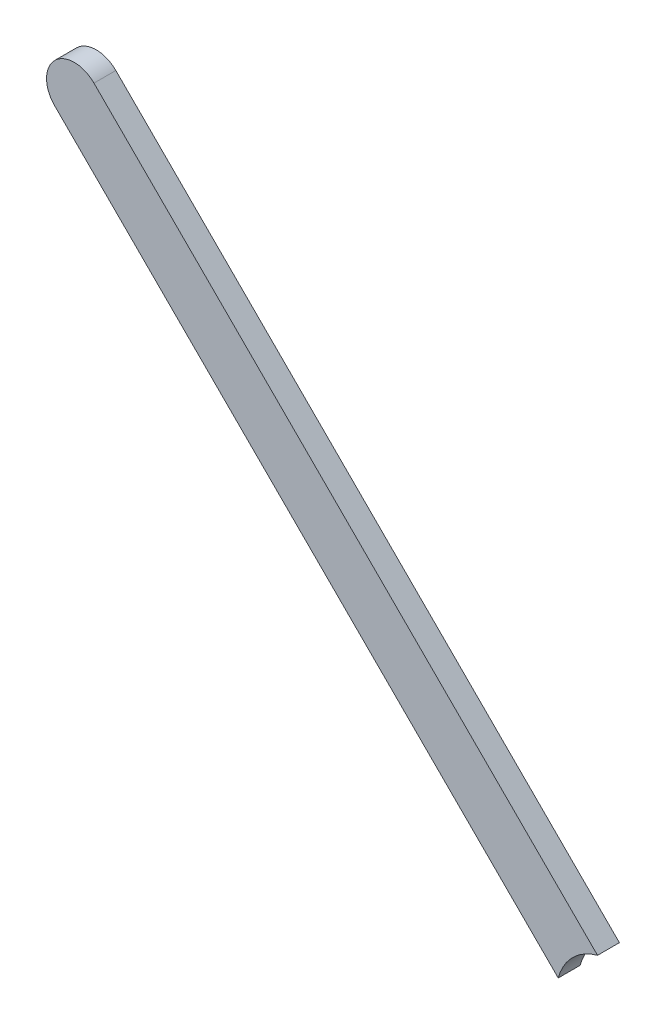
ISO-10303-21;
HEADER;
FILE_DESCRIPTION(('STEP AP214'),'2;1');
FILE_NAME('part.step','',(''),(''),'','','');
FILE_SCHEMA(('AUTOMOTIVE_DESIGN { 1 0 10303 214 1 1 1 1 }'));
ENDSEC;
DATA;
#1=APPLICATION_CONTEXT('core data for automotive mechanical design processes');
#2=APPLICATION_PROTOCOL_DEFINITION('international standard','automotive_design',2000,#1);
#3=PRODUCT_CONTEXT('',#1,'mechanical');
#4=PRODUCT('Part','Part','',(#3));
#5=PRODUCT_RELATED_PRODUCT_CATEGORY('part','',(#4));
#6=PRODUCT_DEFINITION_FORMATION('','',#4);
#7=PRODUCT_DEFINITION_CONTEXT('part definition',#1,'design');
#8=PRODUCT_DEFINITION('design','',#6,#7);
#9=PRODUCT_DEFINITION_SHAPE('','',#8);
#10=(LENGTH_UNIT() NAMED_UNIT(*) SI_UNIT(.MILLI.,.METRE.));
#11=(NAMED_UNIT(*) PLANE_ANGLE_UNIT() SI_UNIT($,.RADIAN.));
#12=(NAMED_UNIT(*) SI_UNIT($,.STERADIAN.) SOLID_ANGLE_UNIT());
#13=UNCERTAINTY_MEASURE_WITH_UNIT(LENGTH_MEASURE(1.E-05),#10,'distance_accuracy_value','');
#14=(GEOMETRIC_REPRESENTATION_CONTEXT(3) GLOBAL_UNCERTAINTY_ASSIGNED_CONTEXT((#13)) GLOBAL_UNIT_ASSIGNED_CONTEXT((#10,
#11,#12)) REPRESENTATION_CONTEXT('',''));
#15=CARTESIAN_POINT('',(0.,0.,0.));
#16=DIRECTION('',(0.,0.,1.));
#17=DIRECTION('',(1.,0.,0.));
#18=AXIS2_PLACEMENT_3D('',#15,#16,#17);
#19=CARTESIAN_POINT('',(140.69991926,59.89139406,0.));
#20=DIRECTION('',(0.70710678118655,0.707106781186545,0.));
#21=DIRECTION('',(0.707106781186545,-0.70710678118655,0.));
#22=AXIS2_PLACEMENT_3D('',#19,#20,#21);
#23=PLANE('',#22);
#24=DIRECTION('',(0.707106781186545,-0.70710678118655,0.));
#25=VECTOR('',#24,1.);
#26=CARTESIAN_POINT('',(140.69991926,59.89139406,0.1999996));
#27=LINE('',#26,#25);
#28=CARTESIAN_POINT('',(140.69991926,59.89139406,0.1999996));
#29=VERTEX_POINT('',#28);
#30=CARTESIAN_POINT('',(145.305309334697,55.2860039853028,0.1999996));
#31=VERTEX_POINT('',#30);
#32=EDGE_CURVE('E11',#29,#31,#27,.T.);
#33=ORIENTED_EDGE('',*,*,#32,.F.);
#34=DIRECTION('',(0.,0.,1.));
#35=VECTOR('',#34,1.);
#36=CARTESIAN_POINT('',(140.69991926,59.89139406,0.));
#37=LINE('',#36,#35);
#38=CARTESIAN_POINT('',(140.69991926,59.89139406,0.));
#39=VERTEX_POINT('',#38);
#40=EDGE_CURVE('E24',#39,#29,#37,.T.);
#41=ORIENTED_EDGE('',*,*,#40,.F.);
#42=DIRECTION('',(0.707106781186545,-0.70710678118655,0.));
#43=VECTOR('',#42,1.);
#44=CARTESIAN_POINT('',(140.69991926,59.89139406,0.));
#45=LINE('',#44,#43);
#46=CARTESIAN_POINT('',(145.305309334697,55.2860039853028,0.));
#47=VERTEX_POINT('',#46);
#48=EDGE_CURVE('E75',#39,#47,#45,.T.);
#49=ORIENTED_EDGE('',*,*,#48,.T.);
#50=DIRECTION('',(0.,0.,1.));
#51=VECTOR('',#50,1.);
#52=CARTESIAN_POINT('',(145.305309334697,55.2860039853028,0.));
#53=LINE('',#52,#51);
#54=EDGE_CURVE('E37',#47,#31,#53,.T.);
#55=ORIENTED_EDGE('',*,*,#54,.T.);
#56=EDGE_LOOP('',(#33,#41,#49,#55));
#57=FACE_BOUND('',#56,.T.);
#58=ADVANCED_FACE('F17',(#57),#23,.F.);
#59=CARTESIAN_POINT('',(145.796,55.1545252,0.));
#60=DIRECTION('',(0.,0.,-1.));
#61=DIRECTION('',(1.,0.,0.));
#62=AXIS2_PLACEMENT_3D('',#59,#60,#61);
#63=CYLINDRICAL_SURFACE('',#62,0.508);
#64=DIRECTION('',(0.,0.,1.));
#65=VECTOR('',#64,1.);
#66=CARTESIAN_POINT('',(145.664521214697,55.6452158653028,0.));
#67=LINE('',#66,#65);
#68=CARTESIAN_POINT('',(145.664521214697,55.6452158653028,0.));
#69=VERTEX_POINT('',#68);
#70=CARTESIAN_POINT('',(145.664521214697,55.6452158653028,0.1999996));
#71=VERTEX_POINT('',#70);
#72=EDGE_CURVE('E67',#69,#71,#67,.T.);
#73=ORIENTED_EDGE('',*,*,#72,.T.);
#74=CARTESIAN_POINT('',(145.796,55.1545252,0.1999996));
#75=DIRECTION('',(0.,0.,1.));
#76=DIRECTION('',(1.,0.,0.));
#77=AXIS2_PLACEMENT_3D('',#74,#75,#76);
#78=CIRCLE('',#77,0.508);
#79=EDGE_CURVE('E82',#71,#31,#78,.T.);
#80=ORIENTED_EDGE('',*,*,#79,.T.);
#81=ORIENTED_EDGE('',*,*,#54,.F.);
#82=CARTESIAN_POINT('',(145.796,55.1545252,0.));
#83=DIRECTION('',(0.,0.,1.));
#84=DIRECTION('',(1.,0.,0.));
#85=AXIS2_PLACEMENT_3D('',#82,#83,#84);
#86=CIRCLE('',#85,0.508);
#87=EDGE_CURVE('E80',#69,#47,#86,.T.);
#88=ORIENTED_EDGE('',*,*,#87,.F.);
#89=EDGE_LOOP('',(#73,#80,#81,#88));
#90=FACE_BOUND('',#89,.T.);
#91=ADVANCED_FACE('F88',(#90),#63,.F.);
#92=CARTESIAN_POINT('',(145.664521214697,55.6452158653028,0.));
#93=DIRECTION('',(-0.707106781186549,-0.707106781186546,0.));
#94=DIRECTION('',(-0.707106781186546,0.707106781186549,0.));
#95=AXIS2_PLACEMENT_3D('',#92,#93,#94);
#96=PLANE('',#95);
#97=DIRECTION('',(-0.707106781186546,0.707106781186549,0.));
#98=VECTOR('',#97,1.);
#99=CARTESIAN_POINT('',(145.97560594,55.33413114,0.1999996));
#100=LINE('',#99,#98);
#101=CARTESIAN_POINT('',(141.05913114,60.25060594,0.1999996));
#102=VERTEX_POINT('',#101);
#103=EDGE_CURVE('E71',#71,#102,#100,.T.);
#104=ORIENTED_EDGE('',*,*,#103,.F.);
#105=ORIENTED_EDGE('',*,*,#72,.F.);
#106=DIRECTION('',(-0.707106781186546,0.707106781186549,0.));
#107=VECTOR('',#106,1.);
#108=CARTESIAN_POINT('',(145.97560594,55.33413114,0.));
#109=LINE('',#108,#107);
#110=CARTESIAN_POINT('',(141.05913114,60.25060594,0.));
#111=VERTEX_POINT('',#110);
#112=EDGE_CURVE('E63',#69,#111,#109,.T.);
#113=ORIENTED_EDGE('',*,*,#112,.T.);
#114=DIRECTION('',(0.,0.,1.));
#115=VECTOR('',#114,1.);
#116=CARTESIAN_POINT('',(141.05913114,60.25060594,0.));
#117=LINE('',#116,#115);
#118=EDGE_CURVE('E53',#111,#102,#117,.T.);
#119=ORIENTED_EDGE('',*,*,#118,.T.);
#120=EDGE_LOOP('',(#104,#105,#113,#119));
#121=FACE_BOUND('',#120,.T.);
#122=ADVANCED_FACE('F66',(#121),#96,.F.);
#123=CARTESIAN_POINT('',(140.8795252,60.071,0.));
#124=DIRECTION('',(0.,0.,-1.));
#125=DIRECTION('',(0.707106781186576,0.70710678118652,0.));
#126=AXIS2_PLACEMENT_3D('',#123,#124,#125);
#127=CYLINDRICAL_SURFACE('',#126,0.254001156230768);
#128=CARTESIAN_POINT('',(140.8795252,60.071,0.1999996));
#129=DIRECTION('',(0.,0.,1.));
#130=DIRECTION('',(0.707106781186576,0.70710678118652,0.));
#131=AXIS2_PLACEMENT_3D('',#128,#129,#130);
#132=CIRCLE('',#131,0.254001156230768);
#133=EDGE_CURVE('E59',#102,#29,#132,.T.);
#134=ORIENTED_EDGE('',*,*,#133,.F.);
#135=ORIENTED_EDGE('',*,*,#118,.F.);
#136=CARTESIAN_POINT('',(140.8795252,60.071,0.));
#137=DIRECTION('',(0.,0.,1.));
#138=DIRECTION('',(0.707106781186576,0.70710678118652,0.));
#139=AXIS2_PLACEMENT_3D('',#136,#137,#138);
#140=CIRCLE('',#139,0.254001156230768);
#141=EDGE_CURVE('E57',#111,#39,#140,.T.);
#142=ORIENTED_EDGE('',*,*,#141,.T.);
#143=ORIENTED_EDGE('',*,*,#40,.T.);
#144=EDGE_LOOP('',(#134,#135,#142,#143));
#145=FACE_BOUND('',#144,.T.);
#146=ADVANCED_FACE('F55',(#145),#127,.T.);
#147=CARTESIAN_POINT('',(140.69991926,59.89139406,0.));
#148=DIRECTION('',(0.,0.,-1.));
#149=DIRECTION('',(-1.,0.,0.));
#150=AXIS2_PLACEMENT_3D('',#147,#148,#149);
#151=PLANE('',#150);
#152=ORIENTED_EDGE('',*,*,#48,.F.);
#153=ORIENTED_EDGE('',*,*,#141,.F.);
#154=ORIENTED_EDGE('',*,*,#112,.F.);
#155=ORIENTED_EDGE('',*,*,#87,.T.);
#156=EDGE_LOOP('',(#152,#153,#154,#155));
#157=FACE_BOUND('',#156,.T.);
#158=ADVANCED_FACE('F74',(#157),#151,.T.);
#159=CARTESIAN_POINT('',(140.69991926,59.89139406,0.1999996));
#160=DIRECTION('',(0.,0.,-1.));
#161=DIRECTION('',(-1.,0.,0.));
#162=AXIS2_PLACEMENT_3D('',#159,#160,#161);
#163=PLANE('',#162);
#164=ORIENTED_EDGE('',*,*,#133,.T.);
#165=ORIENTED_EDGE('',*,*,#32,.T.);
#166=ORIENTED_EDGE('',*,*,#79,.F.);
#167=ORIENTED_EDGE('',*,*,#103,.T.);
#168=EDGE_LOOP('',(#164,#165,#166,#167));
#169=FACE_BOUND('',#168,.T.);
#170=ADVANCED_FACE('F91',(#169),#163,.F.);
#171=CLOSED_SHELL('',(#58,#91,#122,#146,#158,#170));
#172=MANIFOLD_SOLID_BREP('B1',#171);
#173=ADVANCED_BREP_SHAPE_REPRESENTATION('',(#18,#172),#14);
#174=SHAPE_DEFINITION_REPRESENTATION(#9,#173);
ENDSEC;
END-ISO-10303-21;
